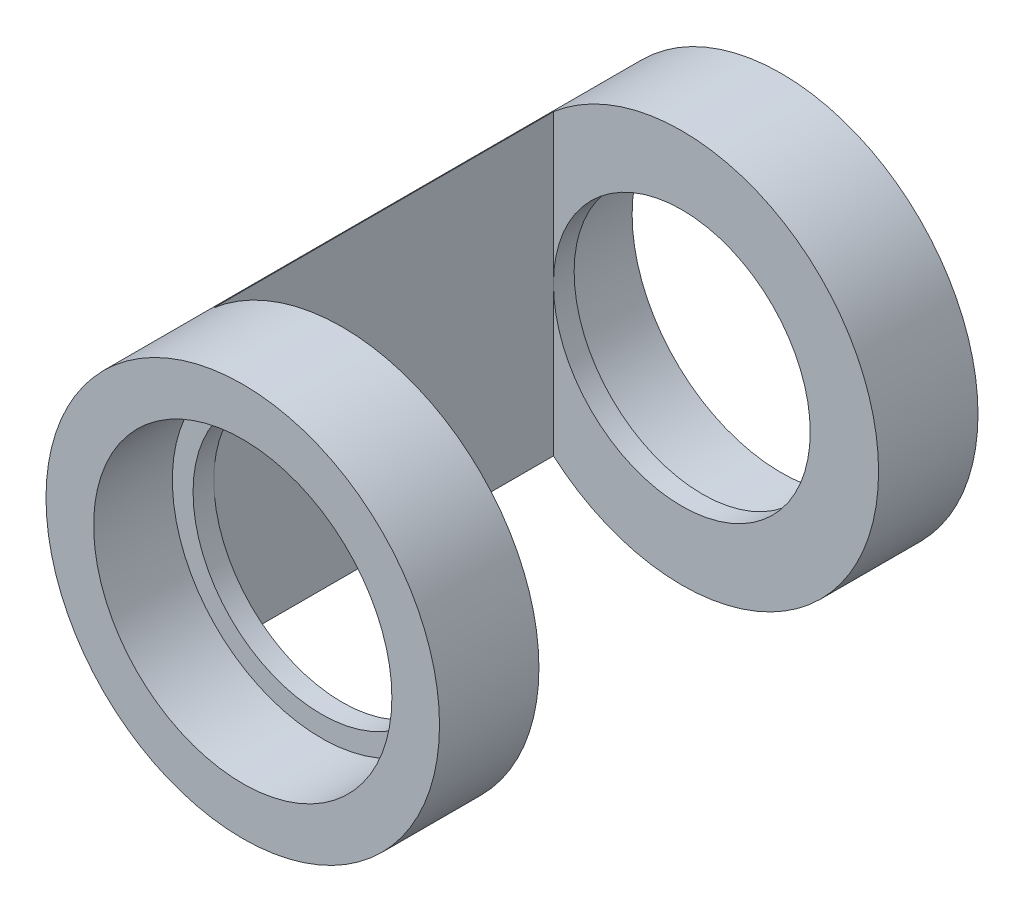
ISO-10303-21;
HEADER;
FILE_DESCRIPTION(('STEP AP214'),'2;1');
FILE_NAME('part.step','',(''),(''),'','','');
FILE_SCHEMA(('AUTOMOTIVE_DESIGN { 1 0 10303 214 1 1 1 1 }'));
ENDSEC;
DATA;
#1=APPLICATION_CONTEXT('core data for automotive mechanical design processes');
#2=APPLICATION_PROTOCOL_DEFINITION('international standard','automotive_design',2000,#1);
#3=PRODUCT_CONTEXT('',#1,'mechanical');
#4=PRODUCT('Part','Part','',(#3));
#5=PRODUCT_RELATED_PRODUCT_CATEGORY('part','',(#4));
#6=PRODUCT_DEFINITION_FORMATION('','',#4);
#7=PRODUCT_DEFINITION_CONTEXT('part definition',#1,'design');
#8=PRODUCT_DEFINITION('design','',#6,#7);
#9=PRODUCT_DEFINITION_SHAPE('','',#8);
#10=(LENGTH_UNIT() NAMED_UNIT(*) SI_UNIT(.MILLI.,.METRE.));
#11=(NAMED_UNIT(*) PLANE_ANGLE_UNIT() SI_UNIT($,.RADIAN.));
#12=(NAMED_UNIT(*) SI_UNIT($,.STERADIAN.) SOLID_ANGLE_UNIT());
#13=UNCERTAINTY_MEASURE_WITH_UNIT(LENGTH_MEASURE(1.E-05),#10,'distance_accuracy_value','');
#14=(GEOMETRIC_REPRESENTATION_CONTEXT(3) GLOBAL_UNCERTAINTY_ASSIGNED_CONTEXT((#13)) GLOBAL_UNIT_ASSIGNED_CONTEXT((#10,
#11,#12)) REPRESENTATION_CONTEXT('',''));
#15=CARTESIAN_POINT('',(0.,0.,0.));
#16=DIRECTION('',(0.,0.,1.));
#17=DIRECTION('',(1.,0.,0.));
#18=AXIS2_PLACEMENT_3D('',#15,#16,#17);
#19=CARTESIAN_POINT('',(0.,0.,130.));
#20=DIRECTION('',(0.,0.,-1.));
#21=DIRECTION('',(-1.,0.,0.));
#22=AXIS2_PLACEMENT_3D('',#19,#20,#21);
#23=CYLINDRICAL_SURFACE('',#22,47.5);
#24=CARTESIAN_POINT('',(0.,0.,0.));
#25=DIRECTION('',(0.,0.,1.));
#26=DIRECTION('',(1.,0.,0.));
#27=AXIS2_PLACEMENT_3D('',#24,#25,#26);
#28=CIRCLE('',#27,47.5);
#29=CARTESIAN_POINT('',(47.5,0.,0.));
#30=VERTEX_POINT('',#29);
#31=EDGE_CURVE('E98',#30,#30,#28,.T.);
#32=ORIENTED_EDGE('',*,*,#31,.T.);
#33=EDGE_LOOP('',(#32));
#34=FACE_BOUND('',#33,.T.);
#35=CARTESIAN_POINT('',(0.,0.,130.));
#36=DIRECTION('',(0.,0.,1.));
#37=DIRECTION('',(1.,0.,0.));
#38=AXIS2_PLACEMENT_3D('',#35,#36,#37);
#39=CIRCLE('',#38,47.5);
#40=CARTESIAN_POINT('',(47.5,0.,130.));
#41=VERTEX_POINT('',#40);
#42=EDGE_CURVE('E101',#41,#41,#39,.T.);
#43=ORIENTED_EDGE('',*,*,#42,.F.);
#44=EDGE_LOOP('',(#43));
#45=FACE_BOUND('',#44,.T.);
#46=CARTESIAN_POINT('',(0.,0.,106.));
#47=DIRECTION('',(0.,0.,-1.));
#48=DIRECTION('',(-1.,0.,0.));
#49=AXIS2_PLACEMENT_3D('',#46,#47,#48);
#50=CIRCLE('',#49,47.5);
#51=CARTESIAN_POINT('',(-31.,35.9895818258562,106.));
#52=VERTEX_POINT('',#51);
#53=CARTESIAN_POINT('',(-31.,-35.9895818258562,106.));
#54=VERTEX_POINT('',#53);
#55=EDGE_CURVE('E63',#52,#54,#50,.T.);
#56=ORIENTED_EDGE('',*,*,#55,.F.);
#57=DIRECTION('',(0.,0.,-1.));
#58=VECTOR('',#57,1.);
#59=CARTESIAN_POINT('',(-31.,35.9895818258562,106.));
#60=LINE('',#59,#58);
#61=CARTESIAN_POINT('',(-31.,35.9895818258562,24.));
#62=VERTEX_POINT('',#61);
#63=EDGE_CURVE('E77',#52,#62,#60,.T.);
#64=ORIENTED_EDGE('',*,*,#63,.T.);
#65=CARTESIAN_POINT('',(0.,0.,24.));
#66=DIRECTION('',(0.,0.,-1.));
#67=DIRECTION('',(-1.,0.,0.));
#68=AXIS2_PLACEMENT_3D('',#65,#66,#67);
#69=CIRCLE('',#68,47.5);
#70=CARTESIAN_POINT('',(-31.,-35.9895818258562,24.));
#71=VERTEX_POINT('',#70);
#72=EDGE_CURVE('E76',#62,#71,#69,.T.);
#73=ORIENTED_EDGE('',*,*,#72,.T.);
#74=DIRECTION('',(0.,0.,-1.));
#75=VECTOR('',#74,1.);
#76=CARTESIAN_POINT('',(-31.,-35.9895818258562,106.));
#77=LINE('',#76,#75);
#78=EDGE_CURVE('E73',#54,#71,#77,.T.);
#79=ORIENTED_EDGE('',*,*,#78,.F.);
#80=EDGE_LOOP('',(#56,#64,#73,#79));
#81=FACE_BOUND('',#80,.T.);
#82=ADVANCED_FACE('F30',(#34,#45,#81),#23,.T.);
#83=CARTESIAN_POINT('',(0.,0.,158.));
#84=DIRECTION('',(0.,0.,-1.));
#85=DIRECTION('',(-1.,0.,0.));
#86=AXIS2_PLACEMENT_3D('',#83,#84,#85);
#87=CYLINDRICAL_SURFACE('',#86,31.);
#88=CARTESIAN_POINT('',(0.,0.,111.));
#89=DIRECTION('',(0.,0.,1.));
#90=DIRECTION('',(1.,0.,0.));
#91=AXIS2_PLACEMENT_3D('',#88,#89,#90);
#92=CIRCLE('',#91,31.);
#93=CARTESIAN_POINT('',(31.,0.,111.));
#94=VERTEX_POINT('',#93);
#95=EDGE_CURVE('E85',#94,#94,#92,.T.);
#96=ORIENTED_EDGE('',*,*,#95,.T.);
#97=EDGE_LOOP('',(#96));
#98=FACE_BOUND('',#97,.T.);
#99=CARTESIAN_POINT('',(0.,0.,106.));
#100=DIRECTION('',(0.,0.,-1.));
#101=DIRECTION('',(-1.,0.,0.));
#102=AXIS2_PLACEMENT_3D('',#99,#100,#101);
#103=CIRCLE('',#102,31.);
#104=CARTESIAN_POINT('',(-31.,0.,106.));
#105=VERTEX_POINT('',#104);
#106=EDGE_CURVE('E11',#105,#105,#103,.F.);
#107=ORIENTED_EDGE('',*,*,#106,.F.);
#108=EDGE_LOOP('',(#107));
#109=FACE_BOUND('',#108,.T.);
#110=ADVANCED_FACE('F121',(#98,#109),#87,.F.);
#111=CARTESIAN_POINT('',(0.,0.,130.));
#112=DIRECTION('',(0.,0.,1.));
#113=DIRECTION('',(1.,0.,0.));
#114=AXIS2_PLACEMENT_3D('',#111,#112,#113);
#115=PLANE('',#114);
#116=CARTESIAN_POINT('',(0.,0.,130.));
#117=DIRECTION('',(0.,0.,1.));
#118=DIRECTION('',(1.,0.,0.));
#119=AXIS2_PLACEMENT_3D('',#116,#117,#118);
#120=CIRCLE('',#119,36.);
#121=CARTESIAN_POINT('',(36.,0.,130.));
#122=VERTEX_POINT('',#121);
#123=EDGE_CURVE('E92',#122,#122,#120,.T.);
#124=ORIENTED_EDGE('',*,*,#123,.F.);
#125=EDGE_LOOP('',(#124));
#126=FACE_BOUND('',#125,.T.);
#127=ORIENTED_EDGE('',*,*,#42,.T.);
#128=EDGE_LOOP('',(#127));
#129=FACE_BOUND('',#128,.T.);
#130=ADVANCED_FACE('F126',(#126,#129),#115,.T.);
#131=CARTESIAN_POINT('',(0.,0.,0.));
#132=DIRECTION('',(0.,0.,1.));
#133=DIRECTION('',(1.,0.,0.));
#134=AXIS2_PLACEMENT_3D('',#131,#132,#133);
#135=PLANE('',#134);
#136=CARTESIAN_POINT('',(0.,0.,0.));
#137=DIRECTION('',(0.,0.,-1.));
#138=DIRECTION('',(-1.,0.,0.));
#139=AXIS2_PLACEMENT_3D('',#136,#137,#138);
#140=CIRCLE('',#139,36.);
#141=CARTESIAN_POINT('',(-36.,0.,0.));
#142=VERTEX_POINT('',#141);
#143=EDGE_CURVE('E88',#142,#142,#140,.T.);
#144=ORIENTED_EDGE('',*,*,#143,.F.);
#145=EDGE_LOOP('',(#144));
#146=FACE_BOUND('',#145,.T.);
#147=ORIENTED_EDGE('',*,*,#31,.F.);
#148=EDGE_LOOP('',(#147));
#149=FACE_BOUND('',#148,.T.);
#150=ADVANCED_FACE('F134',(#146,#149),#135,.F.);
#151=CARTESIAN_POINT('',(0.,0.,111.));
#152=DIRECTION('',(0.,0.,1.));
#153=DIRECTION('',(1.,0.,0.));
#154=AXIS2_PLACEMENT_3D('',#151,#152,#153);
#155=CYLINDRICAL_SURFACE('',#154,36.);
#156=CARTESIAN_POINT('',(0.,0.,111.));
#157=DIRECTION('',(0.,0.,1.));
#158=DIRECTION('',(1.,0.,0.));
#159=AXIS2_PLACEMENT_3D('',#156,#157,#158);
#160=CIRCLE('',#159,36.);
#161=CARTESIAN_POINT('',(36.,0.,111.));
#162=VERTEX_POINT('',#161);
#163=EDGE_CURVE('E95',#162,#162,#160,.T.);
#164=ORIENTED_EDGE('',*,*,#163,.F.);
#165=EDGE_LOOP('',(#164));
#166=FACE_BOUND('',#165,.T.);
#167=ORIENTED_EDGE('',*,*,#123,.T.);
#168=EDGE_LOOP('',(#167));
#169=FACE_BOUND('',#168,.T.);
#170=ADVANCED_FACE('F140',(#166,#169),#155,.F.);
#171=CARTESIAN_POINT('',(0.,0.,111.));
#172=DIRECTION('',(0.,0.,1.));
#173=DIRECTION('',(1.,0.,0.));
#174=AXIS2_PLACEMENT_3D('',#171,#172,#173);
#175=PLANE('',#174);
#176=ORIENTED_EDGE('',*,*,#95,.F.);
#177=EDGE_LOOP('',(#176));
#178=FACE_BOUND('',#177,.T.);
#179=ORIENTED_EDGE('',*,*,#163,.T.);
#180=EDGE_LOOP('',(#179));
#181=FACE_BOUND('',#180,.T.);
#182=ADVANCED_FACE('F146',(#178,#181),#175,.T.);
#183=CARTESIAN_POINT('',(0.,0.,19.));
#184=DIRECTION('',(0.,0.,-1.));
#185=DIRECTION('',(-1.,0.,0.));
#186=AXIS2_PLACEMENT_3D('',#183,#184,#185);
#187=CYLINDRICAL_SURFACE('',#186,36.);
#188=CARTESIAN_POINT('',(0.,0.,19.));
#189=DIRECTION('',(0.,0.,-1.));
#190=DIRECTION('',(-1.,0.,0.));
#191=AXIS2_PLACEMENT_3D('',#188,#189,#190);
#192=CIRCLE('',#191,36.);
#193=CARTESIAN_POINT('',(-36.,0.,19.));
#194=VERTEX_POINT('',#193);
#195=EDGE_CURVE('E89',#194,#194,#192,.T.);
#196=ORIENTED_EDGE('',*,*,#195,.F.);
#197=EDGE_LOOP('',(#196));
#198=FACE_BOUND('',#197,.T.);
#199=ORIENTED_EDGE('',*,*,#143,.T.);
#200=EDGE_LOOP('',(#199));
#201=FACE_BOUND('',#200,.T.);
#202=ADVANCED_FACE('F150',(#198,#201),#187,.F.);
#203=CARTESIAN_POINT('',(0.,0.,19.));
#204=DIRECTION('',(0.,0.,-1.));
#205=DIRECTION('',(-1.,0.,0.));
#206=AXIS2_PLACEMENT_3D('',#203,#204,#205);
#207=PLANE('',#206);
#208=CARTESIAN_POINT('',(0.,0.,19.));
#209=DIRECTION('',(0.,0.,-1.));
#210=DIRECTION('',(-1.,0.,0.));
#211=AXIS2_PLACEMENT_3D('',#208,#209,#210);
#212=CIRCLE('',#211,31.);
#213=CARTESIAN_POINT('',(-31.,0.,19.));
#214=VERTEX_POINT('',#213);
#215=EDGE_CURVE('E79',#214,#214,#212,.T.);
#216=ORIENTED_EDGE('',*,*,#215,.F.);
#217=EDGE_LOOP('',(#216));
#218=FACE_BOUND('',#217,.T.);
#219=ORIENTED_EDGE('',*,*,#195,.T.);
#220=EDGE_LOOP('',(#219));
#221=FACE_BOUND('',#220,.T.);
#222=ADVANCED_FACE('F154',(#218,#221),#207,.T.);
#223=CARTESIAN_POINT('',(0.,0.,24.));
#224=DIRECTION('',(0.,0.,-1.));
#225=DIRECTION('',(-1.,0.,0.));
#226=AXIS2_PLACEMENT_3D('',#223,#224,#225);
#227=CIRCLE('',#226,31.);
#228=CARTESIAN_POINT('',(-31.,0.,24.));
#229=VERTEX_POINT('',#228);
#230=EDGE_CURVE('E37',#229,#229,#227,.F.);
#231=ORIENTED_EDGE('',*,*,#230,.T.);
#232=EDGE_LOOP('',(#231));
#233=FACE_BOUND('',#232,.T.);
#234=ORIENTED_EDGE('',*,*,#215,.T.);
#235=EDGE_LOOP('',(#234));
#236=FACE_BOUND('',#235,.T.);
#237=ADVANCED_FACE('F107',(#233,#236),#87,.F.);
#238=CARTESIAN_POINT('',(-31.,-35.9895818258562,106.));
#239=DIRECTION('',(-1.,0.,0.));
#240=DIRECTION('',(0.,0.,1.));
#241=AXIS2_PLACEMENT_3D('',#238,#239,#240);
#242=PLANE('',#241);
#243=DIRECTION('',(0.,1.,0.));
#244=VECTOR('',#243,1.);
#245=CARTESIAN_POINT('',(-31.,-35.9895818258562,24.));
#246=LINE('',#245,#244);
#247=EDGE_CURVE('E111',#229,#62,#246,.T.);
#248=ORIENTED_EDGE('',*,*,#247,.T.);
#249=ORIENTED_EDGE('',*,*,#63,.F.);
#250=DIRECTION('',(0.,1.,0.));
#251=VECTOR('',#250,1.);
#252=CARTESIAN_POINT('',(-31.,-35.9895818258562,106.));
#253=LINE('',#252,#251);
#254=EDGE_CURVE('E65',#105,#52,#253,.T.);
#255=ORIENTED_EDGE('',*,*,#254,.F.);
#256=EDGE_CURVE('E51',#54,#105,#253,.T.);
#257=ORIENTED_EDGE('',*,*,#256,.F.);
#258=ORIENTED_EDGE('',*,*,#78,.T.);
#259=EDGE_CURVE('E44',#71,#229,#246,.T.);
#260=ORIENTED_EDGE('',*,*,#259,.T.);
#261=EDGE_LOOP('',(#248,#249,#255,#257,#258,#260));
#262=FACE_BOUND('',#261,.T.);
#263=ADVANCED_FACE('F72',(#262),#242,.F.);
#264=CARTESIAN_POINT('',(0.,0.,106.));
#265=DIRECTION('',(0.,0.,-1.));
#266=DIRECTION('',(-1.,0.,0.));
#267=AXIS2_PLACEMENT_3D('',#264,#265,#266);
#268=PLANE('',#267);
#269=ORIENTED_EDGE('',*,*,#254,.T.);
#270=ORIENTED_EDGE('',*,*,#55,.T.);
#271=ORIENTED_EDGE('',*,*,#256,.T.);
#272=ORIENTED_EDGE('',*,*,#106,.T.);
#273=EDGE_LOOP('',(#269,#270,#271,#272));
#274=FACE_BOUND('',#273,.T.);
#275=ADVANCED_FACE('F64',(#274),#268,.T.);
#276=CARTESIAN_POINT('',(0.,0.,24.));
#277=DIRECTION('',(0.,0.,-1.));
#278=DIRECTION('',(-1.,0.,0.));
#279=AXIS2_PLACEMENT_3D('',#276,#277,#278);
#280=PLANE('',#279);
#281=ORIENTED_EDGE('',*,*,#259,.F.);
#282=ORIENTED_EDGE('',*,*,#72,.F.);
#283=ORIENTED_EDGE('',*,*,#247,.F.);
#284=ORIENTED_EDGE('',*,*,#230,.F.);
#285=EDGE_LOOP('',(#281,#282,#283,#284));
#286=FACE_BOUND('',#285,.T.);
#287=ADVANCED_FACE('F110',(#286),#280,.F.);
#288=CLOSED_SHELL('',(#82,#110,#130,#150,#170,#182,#202,#222,#237,#263,#275,#287));
#289=MANIFOLD_SOLID_BREP('B2',#288);
#290=ADVANCED_BREP_SHAPE_REPRESENTATION('',(#18,#289),#14);
#291=SHAPE_DEFINITION_REPRESENTATION(#9,#290);
ENDSEC;
END-ISO-10303-21;
